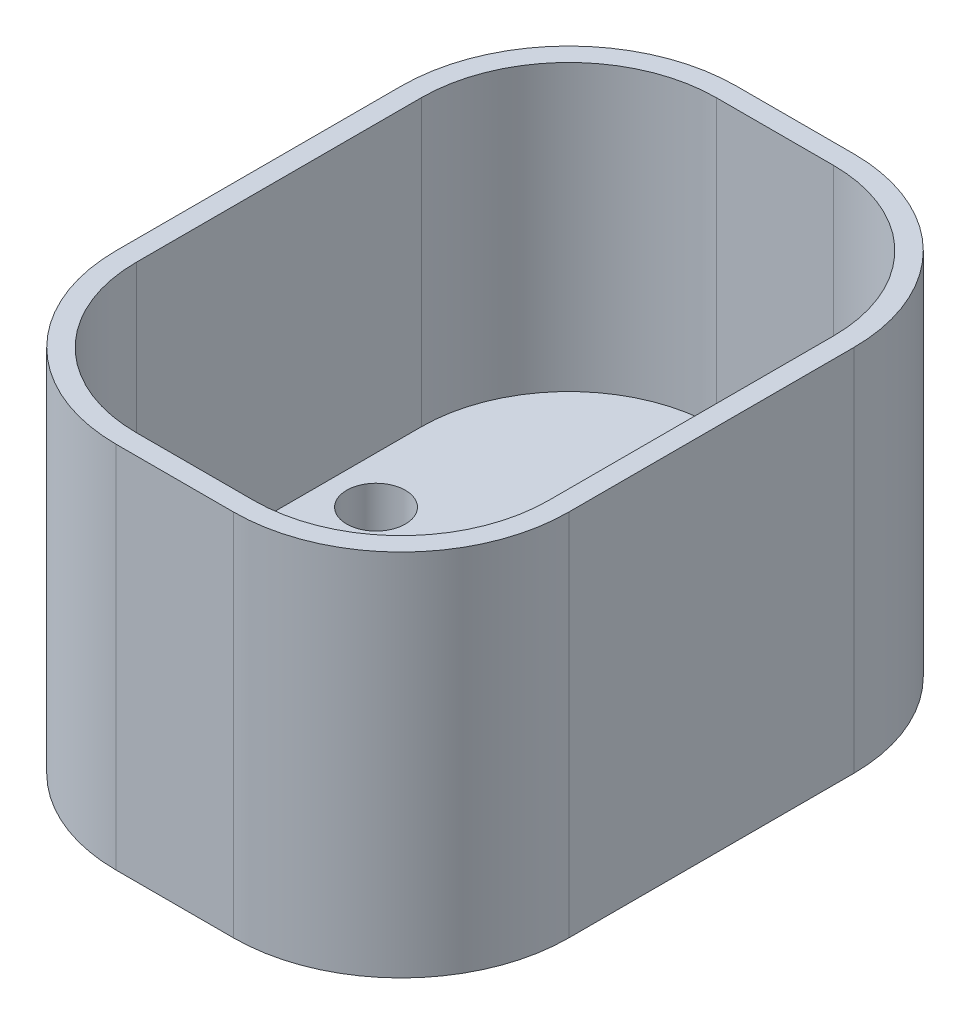
ISO-10303-21;
HEADER;
FILE_DESCRIPTION(('STEP AP214'),'2;1');
FILE_NAME('part.step','',(''),(''),'','','');
FILE_SCHEMA(('AUTOMOTIVE_DESIGN { 1 0 10303 214 1 1 1 1 }'));
ENDSEC;
DATA;
#1=APPLICATION_CONTEXT('core data for automotive mechanical design processes');
#2=APPLICATION_PROTOCOL_DEFINITION('international standard','automotive_design',2000,#1);
#3=PRODUCT_CONTEXT('',#1,'mechanical');
#4=PRODUCT('Part','Part','',(#3));
#5=PRODUCT_RELATED_PRODUCT_CATEGORY('part','',(#4));
#6=PRODUCT_DEFINITION_FORMATION('','',#4);
#7=PRODUCT_DEFINITION_CONTEXT('part definition',#1,'design');
#8=PRODUCT_DEFINITION('design','',#6,#7);
#9=PRODUCT_DEFINITION_SHAPE('','',#8);
#10=(LENGTH_UNIT() NAMED_UNIT(*) SI_UNIT(.MILLI.,.METRE.));
#11=(NAMED_UNIT(*) PLANE_ANGLE_UNIT() SI_UNIT($,.RADIAN.));
#12=(NAMED_UNIT(*) SI_UNIT($,.STERADIAN.) SOLID_ANGLE_UNIT());
#13=UNCERTAINTY_MEASURE_WITH_UNIT(LENGTH_MEASURE(1.E-05),#10,'distance_accuracy_value','');
#14=(GEOMETRIC_REPRESENTATION_CONTEXT(3) GLOBAL_UNCERTAINTY_ASSIGNED_CONTEXT((#13)) GLOBAL_UNIT_ASSIGNED_CONTEXT((#10,
#11,#12)) REPRESENTATION_CONTEXT('',''));
#15=CARTESIAN_POINT('',(0.,0.,0.));
#16=DIRECTION('',(0.,0.,1.));
#17=DIRECTION('',(1.,0.,0.));
#18=AXIS2_PLACEMENT_3D('',#15,#16,#17);
#19=CARTESIAN_POINT('',(-13.5,5.,0.));
#20=DIRECTION('',(1.,0.,0.));
#21=DIRECTION('',(0.,0.,-1.));
#22=AXIS2_PLACEMENT_3D('',#19,#20,#21);
#23=PLANE('',#22);
#24=DIRECTION('',(0.,0.,1.));
#25=VECTOR('',#24,1.);
#26=CARTESIAN_POINT('',(-13.5,0.,0.));
#27=LINE('',#26,#25);
#28=CARTESIAN_POINT('',(-13.5,0.,-13.5));
#29=VERTEX_POINT('',#28);
#30=CARTESIAN_POINT('',(-13.5,0.,3.5));
#31=VERTEX_POINT('',#30);
#32=EDGE_CURVE('E253',#29,#31,#27,.T.);
#33=ORIENTED_EDGE('',*,*,#32,.T.);
#34=DIRECTION('',(0.,-1.,0.));
#35=VECTOR('',#34,1.);
#36=CARTESIAN_POINT('',(-13.5,5.,3.5));
#37=LINE('',#36,#35);
#38=CARTESIAN_POINT('',(-13.5,22.,3.5));
#39=VERTEX_POINT('',#38);
#40=EDGE_CURVE('E13',#31,#39,#37,.F.);
#41=ORIENTED_EDGE('',*,*,#40,.T.);
#42=DIRECTION('',(0.,0.,1.));
#43=VECTOR('',#42,1.);
#44=CARTESIAN_POINT('',(-13.5,22.,-13.5));
#45=LINE('',#44,#43);
#46=CARTESIAN_POINT('',(-13.5,22.,-13.5));
#47=VERTEX_POINT('',#46);
#48=EDGE_CURVE('E240',#47,#39,#45,.T.);
#49=ORIENTED_EDGE('',*,*,#48,.F.);
#50=DIRECTION('',(0.,-1.,0.));
#51=VECTOR('',#50,1.);
#52=CARTESIAN_POINT('',(-13.5,0.,-13.5));
#53=LINE('',#52,#51);
#54=EDGE_CURVE('E57',#47,#29,#53,.T.);
#55=ORIENTED_EDGE('',*,*,#54,.T.);
#56=EDGE_LOOP('',(#33,#41,#49,#55));
#57=FACE_BOUND('',#56,.T.);
#58=ADVANCED_FACE('F49',(#57),#23,.F.);
#59=CARTESIAN_POINT('',(0.,5.,13.5));
#60=DIRECTION('',(0.,0.,-1.));
#61=DIRECTION('',(-1.,0.,0.));
#62=AXIS2_PLACEMENT_3D('',#59,#60,#61);
#63=PLANE('',#62);
#64=DIRECTION('',(1.,0.,0.));
#65=VECTOR('',#64,1.);
#66=CARTESIAN_POINT('',(0.,0.,13.5));
#67=LINE('',#66,#65);
#68=CARTESIAN_POINT('',(-3.5,0.,13.5));
#69=VERTEX_POINT('',#68);
#70=CARTESIAN_POINT('',(3.5,0.,13.5));
#71=VERTEX_POINT('',#70);
#72=EDGE_CURVE('E272',#69,#71,#67,.T.);
#73=ORIENTED_EDGE('',*,*,#72,.T.);
#74=DIRECTION('',(0.,-1.,0.));
#75=VECTOR('',#74,1.);
#76=CARTESIAN_POINT('',(3.5,5.,13.5));
#77=LINE('',#76,#75);
#78=CARTESIAN_POINT('',(3.5,22.,13.5));
#79=VERTEX_POINT('',#78);
#80=EDGE_CURVE('E312',#71,#79,#77,.F.);
#81=ORIENTED_EDGE('',*,*,#80,.T.);
#82=DIRECTION('',(1.,0.,0.));
#83=VECTOR('',#82,1.);
#84=CARTESIAN_POINT('',(-3.5,22.,13.5));
#85=LINE('',#84,#83);
#86=CARTESIAN_POINT('',(-3.5,22.,13.5));
#87=VERTEX_POINT('',#86);
#88=EDGE_CURVE('E246',#87,#79,#85,.T.);
#89=ORIENTED_EDGE('',*,*,#88,.F.);
#90=DIRECTION('',(0.,-1.,0.));
#91=VECTOR('',#90,1.);
#92=CARTESIAN_POINT('',(-3.5,5.,13.5));
#93=LINE('',#92,#91);
#94=EDGE_CURVE('E309',#87,#69,#93,.T.);
#95=ORIENTED_EDGE('',*,*,#94,.T.);
#96=EDGE_LOOP('',(#73,#81,#89,#95));
#97=FACE_BOUND('',#96,.T.);
#98=ADVANCED_FACE('F330',(#97),#63,.F.);
#99=CARTESIAN_POINT('',(13.5,5.,0.));
#100=DIRECTION('',(1.,0.,0.));
#101=DIRECTION('',(0.,0.,-1.));
#102=AXIS2_PLACEMENT_3D('',#99,#100,#101);
#103=PLANE('',#102);
#104=DIRECTION('',(0.,0.,1.));
#105=VECTOR('',#104,1.);
#106=CARTESIAN_POINT('',(13.5,0.,0.));
#107=LINE('',#106,#105);
#108=CARTESIAN_POINT('',(13.5,0.,-13.5));
#109=VERTEX_POINT('',#108);
#110=CARTESIAN_POINT('',(13.5,0.,3.5));
#111=VERTEX_POINT('',#110);
#112=EDGE_CURVE('E275',#109,#111,#107,.T.);
#113=ORIENTED_EDGE('',*,*,#112,.F.);
#114=DIRECTION('',(0.,-1.,0.));
#115=VECTOR('',#114,1.);
#116=CARTESIAN_POINT('',(13.5,5.,-13.5));
#117=LINE('',#116,#115);
#118=CARTESIAN_POINT('',(13.5,22.,-13.5));
#119=VERTEX_POINT('',#118);
#120=EDGE_CURVE('E307',#109,#119,#117,.F.);
#121=ORIENTED_EDGE('',*,*,#120,.T.);
#122=DIRECTION('',(0.,0.,-1.));
#123=VECTOR('',#122,1.);
#124=CARTESIAN_POINT('',(13.5,22.,3.5));
#125=LINE('',#124,#123);
#126=CARTESIAN_POINT('',(13.5,22.,3.5));
#127=VERTEX_POINT('',#126);
#128=EDGE_CURVE('E228',#127,#119,#125,.T.);
#129=ORIENTED_EDGE('',*,*,#128,.F.);
#130=DIRECTION('',(0.,-1.,0.));
#131=VECTOR('',#130,1.);
#132=CARTESIAN_POINT('',(13.5,0.,3.5));
#133=LINE('',#132,#131);
#134=EDGE_CURVE('E304',#127,#111,#133,.T.);
#135=ORIENTED_EDGE('',*,*,#134,.T.);
#136=EDGE_LOOP('',(#113,#121,#129,#135));
#137=FACE_BOUND('',#136,.T.);
#138=ADVANCED_FACE('F339',(#137),#103,.T.);
#139=CARTESIAN_POINT('',(-9.5,5.,-8.));
#140=DIRECTION('',(0.,-1.,0.));
#141=DIRECTION('',(0.,0.,-1.));
#142=AXIS2_PLACEMENT_3D('',#139,#140,#141);
#143=CYLINDRICAL_SURFACE('',#142,1.75);
#144=CARTESIAN_POINT('',(-9.5,5.,-8.));
#145=DIRECTION('',(0.,1.,0.));
#146=DIRECTION('',(0.,0.,1.));
#147=AXIS2_PLACEMENT_3D('',#144,#145,#146);
#148=CIRCLE('',#147,1.75);
#149=CARTESIAN_POINT('',(-9.5,5.,-6.25));
#150=VERTEX_POINT('',#149);
#151=EDGE_CURVE('E263',#150,#150,#148,.T.);
#152=ORIENTED_EDGE('',*,*,#151,.T.);
#153=EDGE_LOOP('',(#152));
#154=FACE_BOUND('',#153,.T.);
#155=CARTESIAN_POINT('',(-9.5,0.,-8.));
#156=DIRECTION('',(0.,1.,0.));
#157=DIRECTION('',(0.,0.,1.));
#158=AXIS2_PLACEMENT_3D('',#155,#156,#157);
#159=CIRCLE('',#158,1.75);
#160=CARTESIAN_POINT('',(-9.5,0.,-6.25));
#161=VERTEX_POINT('',#160);
#162=EDGE_CURVE('E281',#161,#161,#159,.T.);
#163=ORIENTED_EDGE('',*,*,#162,.F.);
#164=EDGE_LOOP('',(#163));
#165=FACE_BOUND('',#164,.T.);
#166=ADVANCED_FACE('F492',(#154,#165),#143,.F.);
#167=CARTESIAN_POINT('',(0.,5.,-13.337));
#168=DIRECTION('',(0.,-1.,0.));
#169=DIRECTION('',(0.,0.,-1.));
#170=AXIS2_PLACEMENT_3D('',#167,#168,#169);
#171=CYLINDRICAL_SURFACE('',#170,1.5);
#172=CARTESIAN_POINT('',(0.,4.95,-13.337));
#173=DIRECTION('',(0.,1.,0.));
#174=DIRECTION('',(0.,0.,1.));
#175=AXIS2_PLACEMENT_3D('',#172,#173,#174);
#176=CIRCLE('',#175,1.5);
#177=CARTESIAN_POINT('',(0.,4.95,-11.837));
#178=VERTEX_POINT('',#177);
#179=EDGE_CURVE('E269',#178,#178,#176,.T.);
#180=ORIENTED_EDGE('',*,*,#179,.F.);
#181=EDGE_LOOP('',(#180));
#182=FACE_BOUND('',#181,.T.);
#183=CARTESIAN_POINT('',(0.,5.,-13.337));
#184=DIRECTION('',(0.,1.,0.));
#185=DIRECTION('',(0.,0.,1.));
#186=AXIS2_PLACEMENT_3D('',#183,#184,#185);
#187=CIRCLE('',#186,1.5);
#188=CARTESIAN_POINT('',(0.,5.,-11.837));
#189=VERTEX_POINT('',#188);
#190=EDGE_CURVE('E259',#189,#189,#187,.T.);
#191=ORIENTED_EDGE('',*,*,#190,.T.);
#192=EDGE_LOOP('',(#191));
#193=FACE_BOUND('',#192,.T.);
#194=ADVANCED_FACE('F495',(#182,#193),#171,.F.);
#195=CARTESIAN_POINT('',(0.,5.,-23.5));
#196=DIRECTION('',(0.,0.,-1.));
#197=DIRECTION('',(-1.,0.,0.));
#198=AXIS2_PLACEMENT_3D('',#195,#196,#197);
#199=PLANE('',#198);
#200=DIRECTION('',(0.,-1.,0.));
#201=VECTOR('',#200,1.);
#202=CARTESIAN_POINT('',(-3.5,5.,-23.5));
#203=LINE('',#202,#201);
#204=CARTESIAN_POINT('',(-3.5,0.,-23.5));
#205=VERTEX_POINT('',#204);
#206=CARTESIAN_POINT('',(-3.5,22.,-23.5));
#207=VERTEX_POINT('',#206);
#208=EDGE_CURVE('E291',#205,#207,#203,.F.);
#209=ORIENTED_EDGE('',*,*,#208,.T.);
#210=DIRECTION('',(-1.,0.,0.));
#211=VECTOR('',#210,1.);
#212=CARTESIAN_POINT('',(3.5,22.,-23.5));
#213=LINE('',#212,#211);
#214=CARTESIAN_POINT('',(3.5,22.,-23.5));
#215=VERTEX_POINT('',#214);
#216=EDGE_CURVE('E234',#215,#207,#213,.T.);
#217=ORIENTED_EDGE('',*,*,#216,.F.);
#218=DIRECTION('',(0.,-1.,0.));
#219=VECTOR('',#218,1.);
#220=CARTESIAN_POINT('',(3.5,5.,-23.5));
#221=LINE('',#220,#219);
#222=CARTESIAN_POINT('',(3.5,0.,-23.5));
#223=VERTEX_POINT('',#222);
#224=EDGE_CURVE('E293',#215,#223,#221,.T.);
#225=ORIENTED_EDGE('',*,*,#224,.T.);
#226=DIRECTION('',(1.,0.,0.));
#227=VECTOR('',#226,1.);
#228=CARTESIAN_POINT('',(0.,0.,-23.5));
#229=LINE('',#228,#227);
#230=EDGE_CURVE('E278',#205,#223,#229,.T.);
#231=ORIENTED_EDGE('',*,*,#230,.F.);
#232=EDGE_LOOP('',(#209,#217,#225,#231));
#233=FACE_BOUND('',#232,.T.);
#234=ADVANCED_FACE('F346',(#233),#199,.T.);
#235=CARTESIAN_POINT('',(0.,5.,0.));
#236=DIRECTION('',(0.,-1.,0.));
#237=DIRECTION('',(0.,0.,-1.));
#238=AXIS2_PLACEMENT_3D('',#235,#236,#237);
#239=CYLINDRICAL_SURFACE('',#238,8.05);
#240=CARTESIAN_POINT('',(0.,2.,0.));
#241=DIRECTION('',(0.,1.,0.));
#242=DIRECTION('',(0.,0.,1.));
#243=AXIS2_PLACEMENT_3D('',#240,#241,#242);
#244=CIRCLE('',#243,8.05);
#245=CARTESIAN_POINT('',(0.,2.,8.05));
#246=VERTEX_POINT('',#245);
#247=EDGE_CURVE('E288',#246,#246,#244,.T.);
#248=ORIENTED_EDGE('',*,*,#247,.F.);
#249=EDGE_LOOP('',(#248));
#250=FACE_BOUND('',#249,.T.);
#251=CARTESIAN_POINT('',(0.,5.,0.));
#252=DIRECTION('',(0.,1.,0.));
#253=DIRECTION('',(0.,0.,1.));
#254=AXIS2_PLACEMENT_3D('',#251,#252,#253);
#255=CIRCLE('',#254,8.05);
#256=CARTESIAN_POINT('',(0.,5.,8.05));
#257=VERTEX_POINT('',#256);
#258=EDGE_CURVE('E256',#257,#257,#255,.T.);
#259=ORIENTED_EDGE('',*,*,#258,.T.);
#260=EDGE_LOOP('',(#259));
#261=FACE_BOUND('',#260,.T.);
#262=ADVANCED_FACE('F362',(#250,#261),#239,.F.);
#263=CARTESIAN_POINT('',(9.5,5.,-8.));
#264=DIRECTION('',(0.,-1.,0.));
#265=DIRECTION('',(0.,0.,-1.));
#266=AXIS2_PLACEMENT_3D('',#263,#264,#265);
#267=CYLINDRICAL_SURFACE('',#266,1.75);
#268=CARTESIAN_POINT('',(9.5,5.,-8.));
#269=DIRECTION('',(0.,1.,0.));
#270=DIRECTION('',(0.,0.,1.));
#271=AXIS2_PLACEMENT_3D('',#268,#269,#270);
#272=CIRCLE('',#271,1.75);
#273=CARTESIAN_POINT('',(9.5,5.,-6.25));
#274=VERTEX_POINT('',#273);
#275=EDGE_CURVE('E266',#274,#274,#272,.F.);
#276=ORIENTED_EDGE('',*,*,#275,.F.);
#277=EDGE_LOOP('',(#276));
#278=FACE_BOUND('',#277,.T.);
#279=CARTESIAN_POINT('',(9.5,0.,-8.));
#280=DIRECTION('',(0.,1.,0.));
#281=DIRECTION('',(0.,0.,1.));
#282=AXIS2_PLACEMENT_3D('',#279,#280,#281);
#283=CIRCLE('',#282,1.75);
#284=CARTESIAN_POINT('',(9.5,0.,-6.25));
#285=VERTEX_POINT('',#284);
#286=EDGE_CURVE('E260',#285,#285,#283,.F.);
#287=ORIENTED_EDGE('',*,*,#286,.T.);
#288=EDGE_LOOP('',(#287));
#289=FACE_BOUND('',#288,.T.);
#290=ADVANCED_FACE('F365',(#278,#289),#267,.F.);
#291=CARTESIAN_POINT('',(0.,5.,0.));
#292=DIRECTION('',(0.,1.,0.));
#293=DIRECTION('',(0.,0.,1.));
#294=AXIS2_PLACEMENT_3D('',#291,#292,#293);
#295=PLANE('',#294);
#296=CARTESIAN_POINT('',(-3.5,5.,-13.5));
#297=DIRECTION('',(0.,1.,0.));
#298=DIRECTION('',(0.,0.,1.));
#299=AXIS2_PLACEMENT_3D('',#296,#297,#298);
#300=CIRCLE('',#299,8.8);
#301=CARTESIAN_POINT('',(-3.5,5.,-22.3));
#302=VERTEX_POINT('',#301);
#303=CARTESIAN_POINT('',(-12.3,5.,-13.5));
#304=VERTEX_POINT('',#303);
#305=EDGE_CURVE('E64',#302,#304,#300,.T.);
#306=ORIENTED_EDGE('',*,*,#305,.T.);
#307=DIRECTION('',(0.,0.,1.));
#308=VECTOR('',#307,1.);
#309=CARTESIAN_POINT('',(-12.3,5.,-13.5));
#310=LINE('',#309,#308);
#311=CARTESIAN_POINT('',(-12.3,5.,3.5));
#312=VERTEX_POINT('',#311);
#313=EDGE_CURVE('E68',#304,#312,#310,.T.);
#314=ORIENTED_EDGE('',*,*,#313,.T.);
#315=CARTESIAN_POINT('',(-3.5,5.,3.5));
#316=DIRECTION('',(0.,1.,0.));
#317=DIRECTION('',(0.,0.,1.));
#318=AXIS2_PLACEMENT_3D('',#315,#316,#317);
#319=CIRCLE('',#318,8.8);
#320=CARTESIAN_POINT('',(-3.5,5.,12.3));
#321=VERTEX_POINT('',#320);
#322=EDGE_CURVE('E198',#312,#321,#319,.T.);
#323=ORIENTED_EDGE('',*,*,#322,.T.);
#324=DIRECTION('',(1.,0.,0.));
#325=VECTOR('',#324,1.);
#326=CARTESIAN_POINT('',(-3.5,5.,12.3));
#327=LINE('',#326,#325);
#328=CARTESIAN_POINT('',(3.5,5.,12.3));
#329=VERTEX_POINT('',#328);
#330=EDGE_CURVE('E200',#321,#329,#327,.T.);
#331=ORIENTED_EDGE('',*,*,#330,.T.);
#332=CARTESIAN_POINT('',(3.5,5.,3.5));
#333=DIRECTION('',(0.,1.,0.));
#334=DIRECTION('',(0.,0.,1.));
#335=AXIS2_PLACEMENT_3D('',#332,#333,#334);
#336=CIRCLE('',#335,8.8);
#337=CARTESIAN_POINT('',(12.3,5.,3.5));
#338=VERTEX_POINT('',#337);
#339=EDGE_CURVE('E202',#329,#338,#336,.T.);
#340=ORIENTED_EDGE('',*,*,#339,.T.);
#341=DIRECTION('',(0.,0.,-1.));
#342=VECTOR('',#341,1.);
#343=CARTESIAN_POINT('',(12.3,5.,3.5));
#344=LINE('',#343,#342);
#345=CARTESIAN_POINT('',(12.3,5.,-13.5));
#346=VERTEX_POINT('',#345);
#347=EDGE_CURVE('E204',#338,#346,#344,.T.);
#348=ORIENTED_EDGE('',*,*,#347,.T.);
#349=CARTESIAN_POINT('',(3.5,5.,-13.5));
#350=DIRECTION('',(0.,1.,0.));
#351=DIRECTION('',(0.,0.,1.));
#352=AXIS2_PLACEMENT_3D('',#349,#350,#351);
#353=CIRCLE('',#352,8.8);
#354=CARTESIAN_POINT('',(3.5,5.,-22.3));
#355=VERTEX_POINT('',#354);
#356=EDGE_CURVE('E206',#346,#355,#353,.T.);
#357=ORIENTED_EDGE('',*,*,#356,.T.);
#358=DIRECTION('',(-1.,0.,0.));
#359=VECTOR('',#358,1.);
#360=CARTESIAN_POINT('',(3.5,5.,-22.3));
#361=LINE('',#360,#359);
#362=EDGE_CURVE('E170',#355,#302,#361,.T.);
#363=ORIENTED_EDGE('',*,*,#362,.T.);
#364=EDGE_LOOP('',(#306,#314,#323,#331,#340,#348,#357,#363));
#365=FACE_BOUND('',#364,.T.);
#366=ORIENTED_EDGE('',*,*,#258,.F.);
#367=EDGE_LOOP('',(#366));
#368=FACE_BOUND('',#367,.T.);
#369=ORIENTED_EDGE('',*,*,#190,.F.);
#370=EDGE_LOOP('',(#369));
#371=FACE_BOUND('',#370,.T.);
#372=ORIENTED_EDGE('',*,*,#151,.F.);
#373=EDGE_LOOP('',(#372));
#374=FACE_BOUND('',#373,.T.);
#375=ORIENTED_EDGE('',*,*,#275,.T.);
#376=EDGE_LOOP('',(#375));
#377=FACE_BOUND('',#376,.T.);
#378=ADVANCED_FACE('F484',(#365,#368,#371,#374,#377),#295,.T.);
#379=CARTESIAN_POINT('',(0.,0.,0.));
#380=DIRECTION('',(0.,1.,0.));
#381=DIRECTION('',(0.,0.,1.));
#382=AXIS2_PLACEMENT_3D('',#379,#380,#381);
#383=PLANE('',#382);
#384=ORIENTED_EDGE('',*,*,#230,.T.);
#385=CARTESIAN_POINT('',(3.5,0.,-13.5));
#386=DIRECTION('',(0.,1.,0.));
#387=DIRECTION('',(0.,0.,1.));
#388=AXIS2_PLACEMENT_3D('',#385,#386,#387);
#389=CIRCLE('',#388,10.);
#390=EDGE_CURVE('E302',#223,#109,#389,.F.);
#391=ORIENTED_EDGE('',*,*,#390,.T.);
#392=ORIENTED_EDGE('',*,*,#112,.T.);
#393=CARTESIAN_POINT('',(3.5,0.,3.5));
#394=DIRECTION('',(0.,1.,0.));
#395=DIRECTION('',(0.,0.,1.));
#396=AXIS2_PLACEMENT_3D('',#393,#394,#395);
#397=CIRCLE('',#396,10.);
#398=EDGE_CURVE('E300',#111,#71,#397,.F.);
#399=ORIENTED_EDGE('',*,*,#398,.T.);
#400=ORIENTED_EDGE('',*,*,#72,.F.);
#401=CARTESIAN_POINT('',(-3.5,0.,3.5));
#402=DIRECTION('',(0.,1.,0.));
#403=DIRECTION('',(0.,0.,1.));
#404=AXIS2_PLACEMENT_3D('',#401,#402,#403);
#405=CIRCLE('',#404,10.);
#406=EDGE_CURVE('E298',#69,#31,#405,.F.);
#407=ORIENTED_EDGE('',*,*,#406,.T.);
#408=ORIENTED_EDGE('',*,*,#32,.F.);
#409=CARTESIAN_POINT('',(-3.5,0.,-13.5));
#410=DIRECTION('',(0.,1.,0.));
#411=DIRECTION('',(0.,0.,1.));
#412=AXIS2_PLACEMENT_3D('',#409,#410,#411);
#413=CIRCLE('',#412,10.);
#414=EDGE_CURVE('E296',#29,#205,#413,.F.);
#415=ORIENTED_EDGE('',*,*,#414,.T.);
#416=EDGE_LOOP('',(#384,#391,#392,#399,#400,#407,#408,#415));
#417=FACE_BOUND('',#416,.T.);
#418=ORIENTED_EDGE('',*,*,#162,.T.);
#419=EDGE_LOOP('',(#418));
#420=FACE_BOUND('',#419,.T.);
#421=ORIENTED_EDGE('',*,*,#286,.F.);
#422=EDGE_LOOP('',(#421));
#423=FACE_BOUND('',#422,.T.);
#424=CARTESIAN_POINT('',(0.,0.,0.));
#425=DIRECTION('',(0.,1.,0.));
#426=DIRECTION('',(0.,0.,1.));
#427=AXIS2_PLACEMENT_3D('',#424,#425,#426);
#428=CIRCLE('',#427,2.8);
#429=CARTESIAN_POINT('',(0.,0.,2.8));
#430=VERTEX_POINT('',#429);
#431=EDGE_CURVE('E249',#430,#430,#428,.T.);
#432=ORIENTED_EDGE('',*,*,#431,.T.);
#433=EDGE_LOOP('',(#432));
#434=FACE_BOUND('',#433,.T.);
#435=ADVANCED_FACE('F321',(#417,#420,#423,#434),#383,.F.);
#436=CARTESIAN_POINT('',(0.,4.95,0.));
#437=DIRECTION('',(0.,1.,0.));
#438=DIRECTION('',(0.,0.,1.));
#439=AXIS2_PLACEMENT_3D('',#436,#437,#438);
#440=PLANE('',#439);
#441=ORIENTED_EDGE('',*,*,#179,.T.);
#442=EDGE_LOOP('',(#441));
#443=FACE_BOUND('',#442,.T.);
#444=ADVANCED_FACE('F479',(#443),#440,.T.);
#445=CARTESIAN_POINT('',(0.,2.,0.));
#446=DIRECTION('',(0.,-1.,0.));
#447=DIRECTION('',(0.,0.,-1.));
#448=AXIS2_PLACEMENT_3D('',#445,#446,#447);
#449=CYLINDRICAL_SURFACE('',#448,2.8);
#450=CARTESIAN_POINT('',(0.,2.,0.));
#451=DIRECTION('',(0.,1.,0.));
#452=DIRECTION('',(0.,0.,1.));
#453=AXIS2_PLACEMENT_3D('',#450,#451,#452);
#454=CIRCLE('',#453,2.8);
#455=CARTESIAN_POINT('',(0.,2.,2.8));
#456=VERTEX_POINT('',#455);
#457=EDGE_CURVE('E250',#456,#456,#454,.T.);
#458=ORIENTED_EDGE('',*,*,#457,.T.);
#459=EDGE_LOOP('',(#458));
#460=FACE_BOUND('',#459,.T.);
#461=ORIENTED_EDGE('',*,*,#431,.F.);
#462=EDGE_LOOP('',(#461));
#463=FACE_BOUND('',#462,.T.);
#464=ADVANCED_FACE('F475',(#460,#463),#449,.F.);
#465=CARTESIAN_POINT('',(0.,2.,0.));
#466=DIRECTION('',(0.,1.,0.));
#467=DIRECTION('',(0.,0.,1.));
#468=AXIS2_PLACEMENT_3D('',#465,#466,#467);
#469=PLANE('',#468);
#470=ORIENTED_EDGE('',*,*,#247,.T.);
#471=EDGE_LOOP('',(#470));
#472=FACE_BOUND('',#471,.T.);
#473=ORIENTED_EDGE('',*,*,#457,.F.);
#474=EDGE_LOOP('',(#473));
#475=FACE_BOUND('',#474,.T.);
#476=ADVANCED_FACE('F369',(#472,#475),#469,.T.);
#477=CARTESIAN_POINT('',(3.5,5.,-13.5));
#478=DIRECTION('',(0.,-1.,0.));
#479=DIRECTION('',(0.,0.,-1.));
#480=AXIS2_PLACEMENT_3D('',#477,#478,#479);
#481=CYLINDRICAL_SURFACE('',#480,10.);
#482=ORIENTED_EDGE('',*,*,#224,.F.);
#483=CARTESIAN_POINT('',(3.5,22.,-13.5));
#484=DIRECTION('',(0.,1.,0.));
#485=DIRECTION('',(0.,0.,1.));
#486=AXIS2_PLACEMENT_3D('',#483,#484,#485);
#487=CIRCLE('',#486,10.);
#488=EDGE_CURVE('E231',#119,#215,#487,.T.);
#489=ORIENTED_EDGE('',*,*,#488,.F.);
#490=ORIENTED_EDGE('',*,*,#120,.F.);
#491=ORIENTED_EDGE('',*,*,#390,.F.);
#492=EDGE_LOOP('',(#482,#489,#490,#491));
#493=FACE_BOUND('',#492,.T.);
#494=ADVANCED_FACE('F344',(#493),#481,.T.);
#495=CARTESIAN_POINT('',(3.5,5.,3.5));
#496=DIRECTION('',(0.,1.,0.));
#497=DIRECTION('',(0.,0.,1.));
#498=AXIS2_PLACEMENT_3D('',#495,#496,#497);
#499=CYLINDRICAL_SURFACE('',#498,10.);
#500=ORIENTED_EDGE('',*,*,#134,.F.);
#501=CARTESIAN_POINT('',(3.5,22.,3.5));
#502=DIRECTION('',(0.,1.,0.));
#503=DIRECTION('',(0.,0.,1.));
#504=AXIS2_PLACEMENT_3D('',#501,#502,#503);
#505=CIRCLE('',#504,10.);
#506=EDGE_CURVE('E175',#79,#127,#505,.T.);
#507=ORIENTED_EDGE('',*,*,#506,.F.);
#508=ORIENTED_EDGE('',*,*,#80,.F.);
#509=ORIENTED_EDGE('',*,*,#398,.F.);
#510=EDGE_LOOP('',(#500,#507,#508,#509));
#511=FACE_BOUND('',#510,.T.);
#512=ADVANCED_FACE('F335',(#511),#499,.T.);
#513=CARTESIAN_POINT('',(-3.5,5.,3.5));
#514=DIRECTION('',(0.,-1.,0.));
#515=DIRECTION('',(0.,0.,-1.));
#516=AXIS2_PLACEMENT_3D('',#513,#514,#515);
#517=CYLINDRICAL_SURFACE('',#516,10.);
#518=ORIENTED_EDGE('',*,*,#94,.F.);
#519=CARTESIAN_POINT('',(-3.5,22.,3.5));
#520=DIRECTION('',(0.,1.,0.));
#521=DIRECTION('',(0.,0.,1.));
#522=AXIS2_PLACEMENT_3D('',#519,#520,#521);
#523=CIRCLE('',#522,10.);
#524=EDGE_CURVE('E243',#39,#87,#523,.T.);
#525=ORIENTED_EDGE('',*,*,#524,.F.);
#526=ORIENTED_EDGE('',*,*,#40,.F.);
#527=ORIENTED_EDGE('',*,*,#406,.F.);
#528=EDGE_LOOP('',(#518,#525,#526,#527));
#529=FACE_BOUND('',#528,.T.);
#530=ADVANCED_FACE('F326',(#529),#517,.T.);
#531=CARTESIAN_POINT('',(-3.5,5.,-13.5));
#532=DIRECTION('',(0.,1.,0.));
#533=DIRECTION('',(0.,0.,1.));
#534=AXIS2_PLACEMENT_3D('',#531,#532,#533);
#535=CYLINDRICAL_SURFACE('',#534,10.);
#536=ORIENTED_EDGE('',*,*,#54,.F.);
#537=CARTESIAN_POINT('',(-3.5,22.,-13.5));
#538=DIRECTION('',(0.,1.,0.));
#539=DIRECTION('',(0.,0.,1.));
#540=AXIS2_PLACEMENT_3D('',#537,#538,#539);
#541=CIRCLE('',#540,10.);
#542=EDGE_CURVE('E237',#207,#47,#541,.T.);
#543=ORIENTED_EDGE('',*,*,#542,.F.);
#544=ORIENTED_EDGE('',*,*,#208,.F.);
#545=ORIENTED_EDGE('',*,*,#414,.F.);
#546=EDGE_LOOP('',(#536,#543,#544,#545));
#547=FACE_BOUND('',#546,.T.);
#548=ADVANCED_FACE('F51',(#547),#535,.T.);
#549=CARTESIAN_POINT('',(3.5,22.,3.5));
#550=DIRECTION('',(0.,1.,0.));
#551=DIRECTION('',(0.,0.,1.));
#552=AXIS2_PLACEMENT_3D('',#549,#550,#551);
#553=PLANE('',#552);
#554=ORIENTED_EDGE('',*,*,#506,.T.);
#555=ORIENTED_EDGE('',*,*,#128,.T.);
#556=ORIENTED_EDGE('',*,*,#488,.T.);
#557=ORIENTED_EDGE('',*,*,#216,.T.);
#558=ORIENTED_EDGE('',*,*,#542,.T.);
#559=ORIENTED_EDGE('',*,*,#48,.T.);
#560=ORIENTED_EDGE('',*,*,#524,.T.);
#561=ORIENTED_EDGE('',*,*,#88,.T.);
#562=EDGE_LOOP('',(#554,#555,#556,#557,#558,#559,#560,#561));
#563=FACE_BOUND('',#562,.T.);
#564=DIRECTION('',(0.,0.,1.));
#565=VECTOR('',#564,1.);
#566=CARTESIAN_POINT('',(-12.3,22.,-13.5));
#567=LINE('',#566,#565);
#568=CARTESIAN_POINT('',(-12.3,22.,-13.5));
#569=VERTEX_POINT('',#568);
#570=CARTESIAN_POINT('',(-12.3,22.,3.5));
#571=VERTEX_POINT('',#570);
#572=EDGE_CURVE('E169',#569,#571,#567,.T.);
#573=ORIENTED_EDGE('',*,*,#572,.F.);
#574=CARTESIAN_POINT('',(-3.5,22.,-13.5));
#575=DIRECTION('',(0.,1.,0.));
#576=DIRECTION('',(0.,0.,1.));
#577=AXIS2_PLACEMENT_3D('',#574,#575,#576);
#578=CIRCLE('',#577,8.8);
#579=CARTESIAN_POINT('',(-3.5,22.,-22.3));
#580=VERTEX_POINT('',#579);
#581=EDGE_CURVE('E160',#580,#569,#578,.T.);
#582=ORIENTED_EDGE('',*,*,#581,.F.);
#583=DIRECTION('',(-1.,0.,0.));
#584=VECTOR('',#583,1.);
#585=CARTESIAN_POINT('',(3.5,22.,-22.3));
#586=LINE('',#585,#584);
#587=CARTESIAN_POINT('',(3.5,22.,-22.3));
#588=VERTEX_POINT('',#587);
#589=EDGE_CURVE('E194',#588,#580,#586,.T.);
#590=ORIENTED_EDGE('',*,*,#589,.F.);
#591=CARTESIAN_POINT('',(3.5,22.,-13.5));
#592=DIRECTION('',(0.,1.,0.));
#593=DIRECTION('',(0.,0.,1.));
#594=AXIS2_PLACEMENT_3D('',#591,#592,#593);
#595=CIRCLE('',#594,8.8);
#596=CARTESIAN_POINT('',(12.3,22.,-13.5));
#597=VERTEX_POINT('',#596);
#598=EDGE_CURVE('E191',#597,#588,#595,.T.);
#599=ORIENTED_EDGE('',*,*,#598,.F.);
#600=DIRECTION('',(0.,0.,-1.));
#601=VECTOR('',#600,1.);
#602=CARTESIAN_POINT('',(12.3,22.,3.5));
#603=LINE('',#602,#601);
#604=CARTESIAN_POINT('',(12.3,22.,3.5));
#605=VERTEX_POINT('',#604);
#606=EDGE_CURVE('E189',#605,#597,#603,.T.);
#607=ORIENTED_EDGE('',*,*,#606,.F.);
#608=CARTESIAN_POINT('',(3.5,22.,3.5));
#609=DIRECTION('',(0.,1.,0.));
#610=DIRECTION('',(0.,0.,1.));
#611=AXIS2_PLACEMENT_3D('',#608,#609,#610);
#612=CIRCLE('',#611,8.8);
#613=CARTESIAN_POINT('',(3.5,22.,12.3));
#614=VERTEX_POINT('',#613);
#615=EDGE_CURVE('E187',#614,#605,#612,.T.);
#616=ORIENTED_EDGE('',*,*,#615,.F.);
#617=DIRECTION('',(1.,0.,0.));
#618=VECTOR('',#617,1.);
#619=CARTESIAN_POINT('',(-3.5,22.,12.3));
#620=LINE('',#619,#618);
#621=CARTESIAN_POINT('',(-3.5,22.,12.3));
#622=VERTEX_POINT('',#621);
#623=EDGE_CURVE('E183',#622,#614,#620,.T.);
#624=ORIENTED_EDGE('',*,*,#623,.F.);
#625=CARTESIAN_POINT('',(-3.5,22.,3.5));
#626=DIRECTION('',(0.,1.,0.));
#627=DIRECTION('',(0.,0.,1.));
#628=AXIS2_PLACEMENT_3D('',#625,#626,#627);
#629=CIRCLE('',#628,8.8);
#630=EDGE_CURVE('E181',#571,#622,#629,.T.);
#631=ORIENTED_EDGE('',*,*,#630,.F.);
#632=EDGE_LOOP('',(#573,#582,#590,#599,#607,#616,#624,#631));
#633=FACE_BOUND('',#632,.T.);
#634=ADVANCED_FACE('F179',(#563,#633),#553,.T.);
#635=CARTESIAN_POINT('',(-3.5,22.,-13.5));
#636=DIRECTION('',(0.,-1.,0.));
#637=DIRECTION('',(0.,0.,-1.));
#638=AXIS2_PLACEMENT_3D('',#635,#636,#637);
#639=CYLINDRICAL_SURFACE('',#638,8.8);
#640=ORIENTED_EDGE('',*,*,#305,.F.);
#641=DIRECTION('',(0.,-1.,0.));
#642=VECTOR('',#641,1.);
#643=CARTESIAN_POINT('',(-3.5,22.,-22.3));
#644=LINE('',#643,#642);
#645=EDGE_CURVE('E165',#580,#302,#644,.T.);
#646=ORIENTED_EDGE('',*,*,#645,.F.);
#647=ORIENTED_EDGE('',*,*,#581,.T.);
#648=DIRECTION('',(0.,-1.,0.));
#649=VECTOR('',#648,1.);
#650=CARTESIAN_POINT('',(-12.3,22.,-13.5));
#651=LINE('',#650,#649);
#652=EDGE_CURVE('E163',#569,#304,#651,.T.);
#653=ORIENTED_EDGE('',*,*,#652,.T.);
#654=EDGE_LOOP('',(#640,#646,#647,#653));
#655=FACE_BOUND('',#654,.T.);
#656=ADVANCED_FACE('F162',(#655),#639,.F.);
#657=CARTESIAN_POINT('',(-12.3,22.,-13.5));
#658=DIRECTION('',(1.,0.,0.));
#659=DIRECTION('',(0.,0.,-1.));
#660=AXIS2_PLACEMENT_3D('',#657,#658,#659);
#661=PLANE('',#660);
#662=ORIENTED_EDGE('',*,*,#313,.F.);
#663=ORIENTED_EDGE('',*,*,#652,.F.);
#664=ORIENTED_EDGE('',*,*,#572,.T.);
#665=DIRECTION('',(0.,-1.,0.));
#666=VECTOR('',#665,1.);
#667=CARTESIAN_POINT('',(-12.3,22.,3.5));
#668=LINE('',#667,#666);
#669=EDGE_CURVE('E176',#571,#312,#668,.T.);
#670=ORIENTED_EDGE('',*,*,#669,.T.);
#671=EDGE_LOOP('',(#662,#663,#664,#670));
#672=FACE_BOUND('',#671,.T.);
#673=ADVANCED_FACE('F173',(#672),#661,.T.);
#674=CARTESIAN_POINT('',(-3.5,22.,3.5));
#675=DIRECTION('',(0.,-1.,0.));
#676=DIRECTION('',(0.,0.,-1.));
#677=AXIS2_PLACEMENT_3D('',#674,#675,#676);
#678=CYLINDRICAL_SURFACE('',#677,8.8);
#679=ORIENTED_EDGE('',*,*,#322,.F.);
#680=ORIENTED_EDGE('',*,*,#669,.F.);
#681=ORIENTED_EDGE('',*,*,#630,.T.);
#682=DIRECTION('',(0.,-1.,0.));
#683=VECTOR('',#682,1.);
#684=CARTESIAN_POINT('',(-3.5,22.,12.3));
#685=LINE('',#684,#683);
#686=EDGE_CURVE('E222',#622,#321,#685,.T.);
#687=ORIENTED_EDGE('',*,*,#686,.T.);
#688=EDGE_LOOP('',(#679,#680,#681,#687));
#689=FACE_BOUND('',#688,.T.);
#690=ADVANCED_FACE('F409',(#689),#678,.F.);
#691=CARTESIAN_POINT('',(-3.5,22.,12.3));
#692=DIRECTION('',(0.,0.,-1.));
#693=DIRECTION('',(-1.,0.,0.));
#694=AXIS2_PLACEMENT_3D('',#691,#692,#693);
#695=PLANE('',#694);
#696=ORIENTED_EDGE('',*,*,#330,.F.);
#697=ORIENTED_EDGE('',*,*,#686,.F.);
#698=ORIENTED_EDGE('',*,*,#623,.T.);
#699=DIRECTION('',(0.,-1.,0.));
#700=VECTOR('',#699,1.);
#701=CARTESIAN_POINT('',(3.5,22.,12.3));
#702=LINE('',#701,#700);
#703=EDGE_CURVE('E219',#614,#329,#702,.T.);
#704=ORIENTED_EDGE('',*,*,#703,.T.);
#705=EDGE_LOOP('',(#696,#697,#698,#704));
#706=FACE_BOUND('',#705,.T.);
#707=ADVANCED_FACE('F418',(#706),#695,.T.);
#708=CARTESIAN_POINT('',(3.5,22.,3.5));
#709=DIRECTION('',(0.,-1.,0.));
#710=DIRECTION('',(0.,0.,-1.));
#711=AXIS2_PLACEMENT_3D('',#708,#709,#710);
#712=CYLINDRICAL_SURFACE('',#711,8.8);
#713=ORIENTED_EDGE('',*,*,#339,.F.);
#714=ORIENTED_EDGE('',*,*,#703,.F.);
#715=ORIENTED_EDGE('',*,*,#615,.T.);
#716=DIRECTION('',(0.,-1.,0.));
#717=VECTOR('',#716,1.);
#718=CARTESIAN_POINT('',(12.3,22.,3.5));
#719=LINE('',#718,#717);
#720=EDGE_CURVE('E216',#605,#338,#719,.T.);
#721=ORIENTED_EDGE('',*,*,#720,.T.);
#722=EDGE_LOOP('',(#713,#714,#715,#721));
#723=FACE_BOUND('',#722,.T.);
#724=ADVANCED_FACE('F428',(#723),#712,.F.);
#725=CARTESIAN_POINT('',(12.3,22.,3.5));
#726=DIRECTION('',(-1.,0.,0.));
#727=DIRECTION('',(0.,0.,1.));
#728=AXIS2_PLACEMENT_3D('',#725,#726,#727);
#729=PLANE('',#728);
#730=ORIENTED_EDGE('',*,*,#347,.F.);
#731=ORIENTED_EDGE('',*,*,#720,.F.);
#732=ORIENTED_EDGE('',*,*,#606,.T.);
#733=DIRECTION('',(0.,-1.,0.));
#734=VECTOR('',#733,1.);
#735=CARTESIAN_POINT('',(12.3,22.,-13.5));
#736=LINE('',#735,#734);
#737=EDGE_CURVE('E213',#597,#346,#736,.T.);
#738=ORIENTED_EDGE('',*,*,#737,.T.);
#739=EDGE_LOOP('',(#730,#731,#732,#738));
#740=FACE_BOUND('',#739,.T.);
#741=ADVANCED_FACE('F438',(#740),#729,.T.);
#742=CARTESIAN_POINT('',(3.5,22.,-13.5));
#743=DIRECTION('',(0.,-1.,0.));
#744=DIRECTION('',(0.,0.,-1.));
#745=AXIS2_PLACEMENT_3D('',#742,#743,#744);
#746=CYLINDRICAL_SURFACE('',#745,8.8);
#747=ORIENTED_EDGE('',*,*,#356,.F.);
#748=ORIENTED_EDGE('',*,*,#737,.F.);
#749=ORIENTED_EDGE('',*,*,#598,.T.);
#750=DIRECTION('',(0.,-1.,0.));
#751=VECTOR('',#750,1.);
#752=CARTESIAN_POINT('',(3.5,22.,-22.3));
#753=LINE('',#752,#751);
#754=EDGE_CURVE('E210',#588,#355,#753,.T.);
#755=ORIENTED_EDGE('',*,*,#754,.T.);
#756=EDGE_LOOP('',(#747,#748,#749,#755));
#757=FACE_BOUND('',#756,.T.);
#758=ADVANCED_FACE('F448',(#757),#746,.F.);
#759=CARTESIAN_POINT('',(3.5,22.,-22.3));
#760=DIRECTION('',(0.,0.,1.));
#761=DIRECTION('',(1.,0.,0.));
#762=AXIS2_PLACEMENT_3D('',#759,#760,#761);
#763=PLANE('',#762);
#764=ORIENTED_EDGE('',*,*,#362,.F.);
#765=ORIENTED_EDGE('',*,*,#754,.F.);
#766=ORIENTED_EDGE('',*,*,#589,.T.);
#767=ORIENTED_EDGE('',*,*,#645,.T.);
#768=EDGE_LOOP('',(#764,#765,#766,#767));
#769=FACE_BOUND('',#768,.T.);
#770=ADVANCED_FACE('F458',(#769),#763,.T.);
#771=CLOSED_SHELL('',(#58,#98,#138,#166,#194,#234,#262,#290,#378,#435,#444,#464,#476,#494,#512,
#530,#548,#634,#656,#673,#690,#707,#724,#741,#758,#770));
#772=MANIFOLD_SOLID_BREP('B2',#771);
#773=ADVANCED_BREP_SHAPE_REPRESENTATION('',(#18,#772),#14);
#774=SHAPE_DEFINITION_REPRESENTATION(#9,#773);
ENDSEC;
END-ISO-10303-21;
